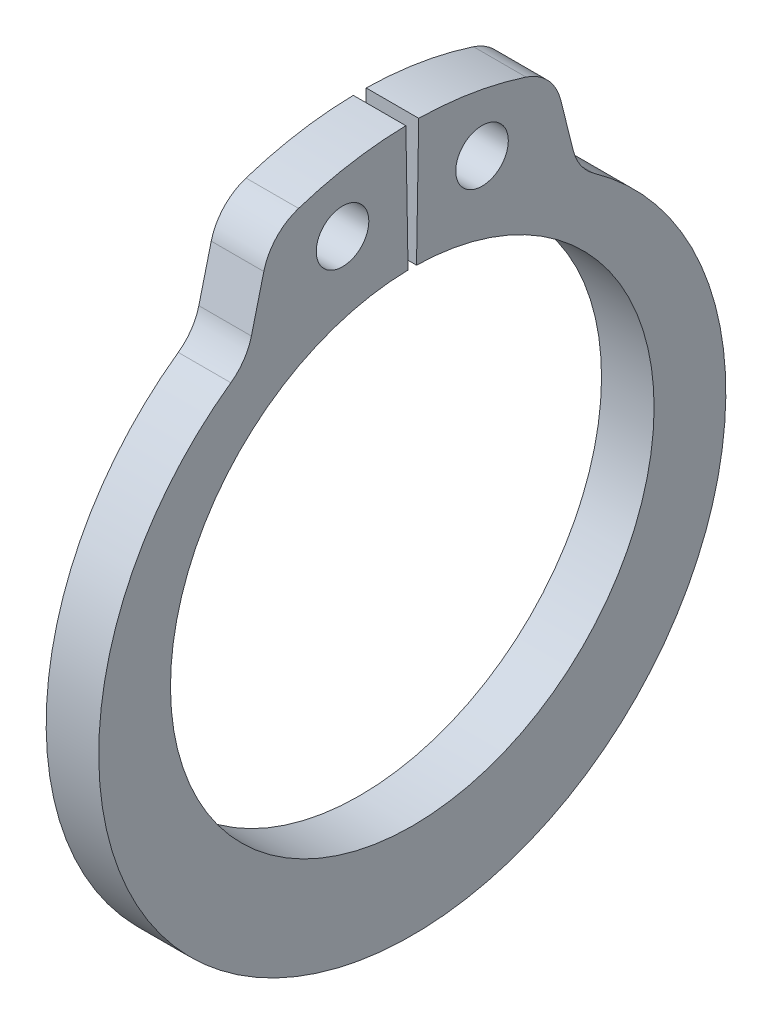
ISO-10303-21;
HEADER;
FILE_DESCRIPTION(('STEP AP214'),'2;1');
FILE_NAME('part.step','',(''),(''),'','','');
FILE_SCHEMA(('AUTOMOTIVE_DESIGN { 1 0 10303 214 1 1 1 1 }'));
ENDSEC;
DATA;
#1=APPLICATION_CONTEXT('core data for automotive mechanical design processes');
#2=APPLICATION_PROTOCOL_DEFINITION('international standard','automotive_design',2000,#1);
#3=PRODUCT_CONTEXT('',#1,'mechanical');
#4=PRODUCT('Part','Part','',(#3));
#5=PRODUCT_RELATED_PRODUCT_CATEGORY('part','',(#4));
#6=PRODUCT_DEFINITION_FORMATION('','',#4);
#7=PRODUCT_DEFINITION_CONTEXT('part definition',#1,'design');
#8=PRODUCT_DEFINITION('design','',#6,#7);
#9=PRODUCT_DEFINITION_SHAPE('','',#8);
#10=(LENGTH_UNIT() NAMED_UNIT(*) SI_UNIT(.MILLI.,.METRE.));
#11=(NAMED_UNIT(*) PLANE_ANGLE_UNIT() SI_UNIT($,.RADIAN.));
#12=(NAMED_UNIT(*) SI_UNIT($,.STERADIAN.) SOLID_ANGLE_UNIT());
#13=UNCERTAINTY_MEASURE_WITH_UNIT(LENGTH_MEASURE(1.E-05),#10,'distance_accuracy_value','');
#14=(GEOMETRIC_REPRESENTATION_CONTEXT(3) GLOBAL_UNCERTAINTY_ASSIGNED_CONTEXT((#13)) GLOBAL_UNIT_ASSIGNED_CONTEXT((#10,
#11,#12)) REPRESENTATION_CONTEXT('',''));
#15=CARTESIAN_POINT('',(0.,0.,0.));
#16=DIRECTION('',(0.,0.,1.));
#17=DIRECTION('',(1.,0.,0.));
#18=AXIS2_PLACEMENT_3D('',#15,#16,#17);
#19=CARTESIAN_POINT('',(0.634999999999997,0.,0.));
#20=DIRECTION('',(1.,0.,0.));
#21=DIRECTION('',(0.,0.,-1.));
#22=AXIS2_PLACEMENT_3D('',#19,#20,#21);
#23=PLANE('',#22);
#24=CARTESIAN_POINT('',(0.634999999999997,7.33771049478921,1.68498677622098));
#25=DIRECTION('',(1.,0.,0.));
#26=DIRECTION('',(0.,0.,-1.));
#27=AXIS2_PLACEMENT_3D('',#24,#25,#26);
#28=CIRCLE('',#27,0.635);
#29=CARTESIAN_POINT('',(0.634999999999997,7.33771049478921,1.04998677622097));
#30=VERTEX_POINT('',#29);
#31=EDGE_CURVE('E219',#30,#30,#28,.T.);
#32=ORIENTED_EDGE('',*,*,#31,.F.);
#33=EDGE_LOOP('',(#32));
#34=FACE_BOUND('',#33,.T.);
#35=CARTESIAN_POINT('',(0.634999999999997,0.,0.));
#36=DIRECTION('',(1.,0.,0.));
#37=DIRECTION('',(0.,0.,-1.));
#38=AXIS2_PLACEMENT_3D('',#35,#36,#37);
#39=CIRCLE('',#38,8.88999999999998);
#40=CARTESIAN_POINT('',(0.634999999999997,8.88864600994027,0.155151893227568));
#41=VERTEX_POINT('',#40);
#42=CARTESIAN_POINT('',(0.634999999999997,8.45481975457246,2.74738474147546));
#43=VERTEX_POINT('',#42);
#44=EDGE_CURVE('E136',#41,#43,#39,.T.);
#45=ORIENTED_EDGE('',*,*,#44,.T.);
#46=CARTESIAN_POINT('',(0.634999999999997,7.24698836106213,2.35490120697901));
#47=DIRECTION('',(1.,0.,0.));
#48=DIRECTION('',(0.,0.,-1.));
#49=AXIS2_PLACEMENT_3D('',#46,#47,#48);
#50=CIRCLE('',#49,1.27);
#51=CARTESIAN_POINT('',(0.634999999999997,7.5542291684737,3.58717677934939));
#52=VERTEX_POINT('',#51);
#53=EDGE_CURVE('E173',#43,#52,#50,.T.);
#54=ORIENTED_EDGE('',*,*,#53,.T.);
#55=DIRECTION('',(0.,-0.970295726276,0.24192189559966));
#56=VECTOR('',#55,1.);
#57=CARTESIAN_POINT('',(0.634999999999997,8.20363873719465,3.42526078855315));
#58=LINE('',#57,#56);
#59=CARTESIAN_POINT('',(0.634999999999997,6.35349195006737,3.88655419195427));
#60=VERTEX_POINT('',#59);
#61=EDGE_CURVE('E211',#52,#60,#58,.T.);
#62=ORIENTED_EDGE('',*,*,#61,.T.);
#63=CARTESIAN_POINT('',(0.634999999999997,6.66073275747919,5.11882976432476));
#64=DIRECTION('',(1.,0.,0.));
#65=DIRECTION('',(0.,0.,-1.));
#66=AXIS2_PLACEMENT_3D('',#63,#64,#65);
#67=CIRCLE('',#66,1.27);
#68=CARTESIAN_POINT('',(0.634999999999997,5.6250079501203,4.38386437505689));
#69=VERTEX_POINT('',#68);
#70=EDGE_CURVE('E184',#60,#69,#67,.F.);
#71=ORIENTED_EDGE('',*,*,#70,.T.);
#72=CARTESIAN_POINT('',(0.634999999999997,-0.552802803479135,2.22044604925031E-13));
#73=DIRECTION('',(1.,0.,0.));
#74=DIRECTION('',(0.,0.,-1.));
#75=AXIS2_PLACEMENT_3D('',#72,#73,#74);
#76=CIRCLE('',#75,7.57519719652095);
#77=CARTESIAN_POINT('',(0.634999999999997,5.62500795011989,-4.38386437505678));
#78=VERTEX_POINT('',#77);
#79=EDGE_CURVE('E206',#69,#78,#76,.T.);
#80=ORIENTED_EDGE('',*,*,#79,.T.);
#81=CARTESIAN_POINT('',(0.634999999999997,6.66073275747869,-5.11882976432459));
#82=DIRECTION('',(1.,0.,0.));
#83=DIRECTION('',(0.,0.,-1.));
#84=AXIS2_PLACEMENT_3D('',#81,#82,#83);
#85=CIRCLE('',#84,1.27);
#86=CARTESIAN_POINT('',(0.634999999999997,6.35349195006704,-3.88655419195427));
#87=VERTEX_POINT('',#86);
#88=EDGE_CURVE('E11',#78,#87,#85,.F.);
#89=ORIENTED_EDGE('',*,*,#88,.T.);
#90=DIRECTION('',(0.,0.970295726275969,0.241921895599793));
#91=VECTOR('',#90,1.);
#92=CARTESIAN_POINT('',(0.634999999999997,8.20363873719476,-3.42526078855288));
#93=LINE('',#92,#91);
#94=CARTESIAN_POINT('',(0.634999999999997,7.55422916847379,-3.58717677934917));
#95=VERTEX_POINT('',#94);
#96=EDGE_CURVE('E205',#87,#95,#93,.T.);
#97=ORIENTED_EDGE('',*,*,#96,.T.);
#98=CARTESIAN_POINT('',(0.634999999999997,7.24698836106205,-2.3549012069789));
#99=DIRECTION('',(1.,0.,0.));
#100=DIRECTION('',(0.,0.,-1.));
#101=AXIS2_PLACEMENT_3D('',#98,#99,#100);
#102=CIRCLE('',#101,1.27);
#103=CARTESIAN_POINT('',(0.634999999999997,8.45481975457224,-2.74738474147518));
#104=VERTEX_POINT('',#103);
#105=EDGE_CURVE('E51',#95,#104,#102,.T.);
#106=ORIENTED_EDGE('',*,*,#105,.T.);
#107=CARTESIAN_POINT('',(0.634999999999997,-5.32907051820075E-12,1.11022302462516E-12));
#108=DIRECTION('',(1.,0.,0.));
#109=DIRECTION('',(0.,0.,1.));
#110=AXIS2_PLACEMENT_3D('',#107,#108,#109);
#111=CIRCLE('',#110,8.89000000000527);
#112=CARTESIAN_POINT('',(0.634999999999997,8.88864600994022,-0.155151893227234));
#113=VERTEX_POINT('',#112);
#114=EDGE_CURVE('E208',#104,#113,#111,.T.);
#115=ORIENTED_EDGE('',*,*,#114,.T.);
#116=DIRECTION('',(0.,-0.999847695156393,0.0174524064372815));
#117=VECTOR('',#116,1.);
#118=CARTESIAN_POINT('',(0.634999999999997,8.88864600994022,-0.155151893227234));
#119=LINE('',#118,#117);
#120=CARTESIAN_POINT('',(0.634999999999997,5.84111023510367,-0.101956958406646));
#121=VERTEX_POINT('',#120);
#122=EDGE_CURVE('E142',#113,#121,#119,.T.);
#123=ORIENTED_EDGE('',*,*,#122,.T.);
#124=CARTESIAN_POINT('',(0.634999999999997,0.,0.));
#125=DIRECTION('',(-1.,0.,0.));
#126=DIRECTION('',(0.,0.,-1.));
#127=AXIS2_PLACEMENT_3D('',#124,#125,#126);
#128=CIRCLE('',#127,5.84199999999999);
#129=CARTESIAN_POINT('',(0.634999999999997,5.84111023510347,0.101956958406757));
#130=VERTEX_POINT('',#129);
#131=EDGE_CURVE('E137',#121,#130,#128,.T.);
#132=ORIENTED_EDGE('',*,*,#131,.T.);
#133=DIRECTION('',(0.,0.999847695156393,0.0174524064372863));
#134=VECTOR('',#133,1.);
#135=CARTESIAN_POINT('',(0.634999999999997,5.84111023510347,0.101956958406757));
#136=LINE('',#135,#134);
#137=EDGE_CURVE('E126',#130,#41,#136,.T.);
#138=ORIENTED_EDGE('',*,*,#137,.T.);
#139=EDGE_LOOP('',(#45,#54,#62,#71,#80,#89,#97,#106,#115,#123,#132,#138));
#140=FACE_BOUND('',#139,.T.);
#141=CARTESIAN_POINT('',(0.634999999999997,7.33771049478929,-1.68498677622086));
#142=DIRECTION('',(1.,0.,0.));
#143=DIRECTION('',(0.,0.,-1.));
#144=AXIS2_PLACEMENT_3D('',#141,#142,#143);
#145=CIRCLE('',#144,0.635);
#146=CARTESIAN_POINT('',(0.634999999999997,7.33771049478929,-2.31998677622087));
#147=VERTEX_POINT('',#146);
#148=EDGE_CURVE('E248',#147,#147,#145,.T.);
#149=ORIENTED_EDGE('',*,*,#148,.F.);
#150=EDGE_LOOP('',(#149));
#151=FACE_BOUND('',#150,.T.);
#152=ADVANCED_FACE('F36',(#34,#140,#151),#23,.T.);
#153=CARTESIAN_POINT('',(-0.634999999999997,0.,0.));
#154=DIRECTION('',(1.,0.,0.));
#155=DIRECTION('',(0.,0.,-1.));
#156=AXIS2_PLACEMENT_3D('',#153,#154,#155);
#157=PLANE('',#156);
#158=CARTESIAN_POINT('',(-0.634999999999997,7.33771049478921,1.68498677622098));
#159=DIRECTION('',(1.,0.,0.));
#160=DIRECTION('',(0.,0.,-1.));
#161=AXIS2_PLACEMENT_3D('',#158,#159,#160);
#162=CIRCLE('',#161,0.635);
#163=CARTESIAN_POINT('',(-0.634999999999997,7.33771049478921,1.04998677622097));
#164=VERTEX_POINT('',#163);
#165=EDGE_CURVE('E245',#164,#164,#162,.T.);
#166=ORIENTED_EDGE('',*,*,#165,.T.);
#167=EDGE_LOOP('',(#166));
#168=FACE_BOUND('',#167,.T.);
#169=DIRECTION('',(0.,-0.970295726276,0.24192189559966));
#170=VECTOR('',#169,1.);
#171=CARTESIAN_POINT('',(-0.634999999999997,8.20363873719465,3.42526078855315));
#172=LINE('',#171,#170);
#173=CARTESIAN_POINT('',(-0.634999999999997,7.5542291684737,3.58717677934939));
#174=VERTEX_POINT('',#173);
#175=CARTESIAN_POINT('',(-0.634999999999997,6.35349195006737,3.88655419195427));
#176=VERTEX_POINT('',#175);
#177=EDGE_CURVE('E202',#174,#176,#172,.T.);
#178=ORIENTED_EDGE('',*,*,#177,.F.);
#179=CARTESIAN_POINT('',(-0.634999999999997,7.24698836106213,2.35490120697901));
#180=DIRECTION('',(1.,0.,0.));
#181=DIRECTION('',(0.,0.,-1.));
#182=AXIS2_PLACEMENT_3D('',#179,#180,#181);
#183=CIRCLE('',#182,1.27);
#184=CARTESIAN_POINT('',(-0.634999999999997,8.45481975457246,2.74738474147546));
#185=VERTEX_POINT('',#184);
#186=EDGE_CURVE('E168',#174,#185,#183,.F.);
#187=ORIENTED_EDGE('',*,*,#186,.T.);
#188=CARTESIAN_POINT('',(-0.634999999999997,0.,0.));
#189=DIRECTION('',(1.,0.,0.));
#190=DIRECTION('',(0.,0.,-1.));
#191=AXIS2_PLACEMENT_3D('',#188,#189,#190);
#192=CIRCLE('',#191,8.88999999999998);
#193=CARTESIAN_POINT('',(-0.634999999999997,8.88864600994027,0.155151893227568));
#194=VERTEX_POINT('',#193);
#195=EDGE_CURVE('E221',#194,#185,#192,.T.);
#196=ORIENTED_EDGE('',*,*,#195,.F.);
#197=DIRECTION('',(0.,0.999847695156393,0.0174524064372863));
#198=VECTOR('',#197,1.);
#199=CARTESIAN_POINT('',(-0.634999999999997,5.84111023510347,0.101956958406757));
#200=LINE('',#199,#198);
#201=CARTESIAN_POINT('',(-0.634999999999997,5.84111023510347,0.101956958406757));
#202=VERTEX_POINT('',#201);
#203=EDGE_CURVE('E218',#202,#194,#200,.T.);
#204=ORIENTED_EDGE('',*,*,#203,.F.);
#205=CARTESIAN_POINT('',(-0.634999999999997,0.,0.));
#206=DIRECTION('',(-1.,0.,0.));
#207=DIRECTION('',(0.,0.,-1.));
#208=AXIS2_PLACEMENT_3D('',#205,#206,#207);
#209=CIRCLE('',#208,5.84199999999999);
#210=CARTESIAN_POINT('',(-0.634999999999997,5.84111023510367,-0.101956958406646));
#211=VERTEX_POINT('',#210);
#212=EDGE_CURVE('E150',#211,#202,#209,.T.);
#213=ORIENTED_EDGE('',*,*,#212,.F.);
#214=DIRECTION('',(0.,-0.999847695156393,0.0174524064372815));
#215=VECTOR('',#214,1.);
#216=CARTESIAN_POINT('',(-0.634999999999997,8.88864600994022,-0.155151893227234));
#217=LINE('',#216,#215);
#218=CARTESIAN_POINT('',(-0.634999999999997,8.88864600994022,-0.155151893227234));
#219=VERTEX_POINT('',#218);
#220=EDGE_CURVE('E146',#219,#211,#217,.T.);
#221=ORIENTED_EDGE('',*,*,#220,.F.);
#222=CARTESIAN_POINT('',(-0.634999999999997,-5.32907051820075E-12,1.11022302462516E-12));
#223=DIRECTION('',(1.,0.,0.));
#224=DIRECTION('',(0.,0.,1.));
#225=AXIS2_PLACEMENT_3D('',#222,#223,#224);
#226=CIRCLE('',#225,8.89000000000527);
#227=CARTESIAN_POINT('',(-0.634999999999997,8.45481975457224,-2.74738474147518));
#228=VERTEX_POINT('',#227);
#229=EDGE_CURVE('E227',#228,#219,#226,.T.);
#230=ORIENTED_EDGE('',*,*,#229,.F.);
#231=CARTESIAN_POINT('',(-0.634999999999997,7.24698836106205,-2.3549012069789));
#232=DIRECTION('',(1.,0.,0.));
#233=DIRECTION('',(0.,0.,-1.));
#234=AXIS2_PLACEMENT_3D('',#231,#232,#233);
#235=CIRCLE('',#234,1.27);
#236=CARTESIAN_POINT('',(-0.634999999999997,7.55422916847379,-3.58717677934917));
#237=VERTEX_POINT('',#236);
#238=EDGE_CURVE('E166',#228,#237,#235,.F.);
#239=ORIENTED_EDGE('',*,*,#238,.T.);
#240=DIRECTION('',(0.,0.970295726275969,0.241921895599793));
#241=VECTOR('',#240,1.);
#242=CARTESIAN_POINT('',(-0.634999999999997,8.20363873719476,-3.42526078855288));
#243=LINE('',#242,#241);
#244=CARTESIAN_POINT('',(-0.634999999999997,6.35349195006704,-3.88655419195427));
#245=VERTEX_POINT('',#244);
#246=EDGE_CURVE('E193',#245,#237,#243,.T.);
#247=ORIENTED_EDGE('',*,*,#246,.F.);
#248=CARTESIAN_POINT('',(-0.634999999999997,6.66073275747869,-5.11882976432459));
#249=DIRECTION('',(1.,0.,0.));
#250=DIRECTION('',(0.,0.,-1.));
#251=AXIS2_PLACEMENT_3D('',#248,#249,#250);
#252=CIRCLE('',#251,1.27);
#253=CARTESIAN_POINT('',(-0.634999999999997,5.62500795011989,-4.38386437505678));
#254=VERTEX_POINT('',#253);
#255=EDGE_CURVE('E44',#245,#254,#252,.T.);
#256=ORIENTED_EDGE('',*,*,#255,.T.);
#257=CARTESIAN_POINT('',(-0.634999999999997,-0.552802803479135,2.22044604925031E-13));
#258=DIRECTION('',(1.,0.,0.));
#259=DIRECTION('',(0.,0.,-1.));
#260=AXIS2_PLACEMENT_3D('',#257,#258,#259);
#261=CIRCLE('',#260,7.57519719652095);
#262=CARTESIAN_POINT('',(-0.634999999999997,5.6250079501203,4.38386437505689));
#263=VERTEX_POINT('',#262);
#264=EDGE_CURVE('E192',#263,#254,#261,.T.);
#265=ORIENTED_EDGE('',*,*,#264,.F.);
#266=CARTESIAN_POINT('',(-0.634999999999997,6.66073275747919,5.11882976432476));
#267=DIRECTION('',(1.,0.,0.));
#268=DIRECTION('',(0.,0.,-1.));
#269=AXIS2_PLACEMENT_3D('',#266,#267,#268);
#270=CIRCLE('',#269,1.27);
#271=EDGE_CURVE('E182',#263,#176,#270,.T.);
#272=ORIENTED_EDGE('',*,*,#271,.T.);
#273=EDGE_LOOP('',(#178,#187,#196,#204,#213,#221,#230,#239,#247,#256,#265,#272));
#274=FACE_BOUND('',#273,.T.);
#275=CARTESIAN_POINT('',(-0.634999999999997,7.33771049478929,-1.68498677622086));
#276=DIRECTION('',(1.,0.,0.));
#277=DIRECTION('',(0.,0.,-1.));
#278=AXIS2_PLACEMENT_3D('',#275,#276,#277);
#279=CIRCLE('',#278,0.635);
#280=CARTESIAN_POINT('',(-0.634999999999997,7.33771049478929,-2.31998677622087));
#281=VERTEX_POINT('',#280);
#282=EDGE_CURVE('E251',#281,#281,#279,.T.);
#283=ORIENTED_EDGE('',*,*,#282,.T.);
#284=EDGE_LOOP('',(#283));
#285=FACE_BOUND('',#284,.T.);
#286=ADVANCED_FACE('F190',(#168,#274,#285),#157,.F.);
#287=CARTESIAN_POINT('',(0.634999999999997,0.,0.));
#288=DIRECTION('',(-1.,0.,0.));
#289=DIRECTION('',(0.,0.,1.));
#290=AXIS2_PLACEMENT_3D('',#287,#288,#289);
#291=CYLINDRICAL_SURFACE('',#290,5.84199999999999);
#292=ORIENTED_EDGE('',*,*,#212,.T.);
#293=DIRECTION('',(-1.,0.,0.));
#294=VECTOR('',#293,1.);
#295=CARTESIAN_POINT('',(0.634999999999997,5.84111023510347,0.101956958406757));
#296=LINE('',#295,#294);
#297=EDGE_CURVE('E130',#130,#202,#296,.T.);
#298=ORIENTED_EDGE('',*,*,#297,.F.);
#299=ORIENTED_EDGE('',*,*,#131,.F.);
#300=DIRECTION('',(-1.,0.,0.));
#301=VECTOR('',#300,1.);
#302=CARTESIAN_POINT('',(0.634999999999997,5.84111023510367,-0.101956958406646));
#303=LINE('',#302,#301);
#304=EDGE_CURVE('E216',#121,#211,#303,.T.);
#305=ORIENTED_EDGE('',*,*,#304,.T.);
#306=EDGE_LOOP('',(#292,#298,#299,#305));
#307=FACE_BOUND('',#306,.T.);
#308=ADVANCED_FACE('F148',(#307),#291,.F.);
#309=CARTESIAN_POINT('',(0.634999999999997,5.84111023510347,0.101956958406757));
#310=DIRECTION('',(0.,-0.0174524064372814,0.999847695156395));
#311=DIRECTION('',(0.,-0.999847695156393,-0.0174524064372863));
#312=AXIS2_PLACEMENT_3D('',#309,#310,#311);
#313=PLANE('',#312);
#314=ORIENTED_EDGE('',*,*,#203,.T.);
#315=DIRECTION('',(-1.,0.,0.));
#316=VECTOR('',#315,1.);
#317=CARTESIAN_POINT('',(0.634999999999997,8.88864600994027,0.155151893227568));
#318=LINE('',#317,#316);
#319=EDGE_CURVE('E133',#41,#194,#318,.T.);
#320=ORIENTED_EDGE('',*,*,#319,.F.);
#321=ORIENTED_EDGE('',*,*,#137,.F.);
#322=ORIENTED_EDGE('',*,*,#297,.T.);
#323=EDGE_LOOP('',(#314,#320,#321,#322));
#324=FACE_BOUND('',#323,.T.);
#325=ADVANCED_FACE('F128',(#324),#313,.F.);
#326=CARTESIAN_POINT('',(0.634999999999997,0.,0.));
#327=DIRECTION('',(-1.,0.,0.));
#328=DIRECTION('',(0.,0.,1.));
#329=AXIS2_PLACEMENT_3D('',#326,#327,#328);
#330=CYLINDRICAL_SURFACE('',#329,8.88999999999998);
#331=ORIENTED_EDGE('',*,*,#195,.T.);
#332=DIRECTION('',(-1.,0.,0.));
#333=VECTOR('',#332,1.);
#334=CARTESIAN_POINT('',(0.634999999999997,8.45481975457246,2.74738474147546));
#335=LINE('',#334,#333);
#336=EDGE_CURVE('E170',#185,#43,#335,.F.);
#337=ORIENTED_EDGE('',*,*,#336,.T.);
#338=ORIENTED_EDGE('',*,*,#44,.F.);
#339=ORIENTED_EDGE('',*,*,#319,.T.);
#340=EDGE_LOOP('',(#331,#337,#338,#339));
#341=FACE_BOUND('',#340,.T.);
#342=ADVANCED_FACE('F239',(#341),#330,.T.);
#343=CARTESIAN_POINT('',(0.634999999999997,8.20363873719465,3.42526078855315));
#344=DIRECTION('',(0.,-0.241921895599664,-0.970295726276003));
#345=DIRECTION('',(0.,0.970295726276,-0.24192189559966));
#346=AXIS2_PLACEMENT_3D('',#343,#344,#345);
#347=PLANE('',#346);
#348=ORIENTED_EDGE('',*,*,#177,.T.);
#349=DIRECTION('',(1.,0.,0.));
#350=VECTOR('',#349,1.);
#351=CARTESIAN_POINT('',(0.634999999999997,6.35349195006737,3.88655419195427));
#352=LINE('',#351,#350);
#353=EDGE_CURVE('E164',#176,#60,#352,.T.);
#354=ORIENTED_EDGE('',*,*,#353,.T.);
#355=ORIENTED_EDGE('',*,*,#61,.F.);
#356=DIRECTION('',(-1.,0.,0.));
#357=VECTOR('',#356,1.);
#358=CARTESIAN_POINT('',(0.634999999999997,7.5542291684737,3.58717677934939));
#359=LINE('',#358,#357);
#360=EDGE_CURVE('E161',#52,#174,#359,.T.);
#361=ORIENTED_EDGE('',*,*,#360,.T.);
#362=EDGE_LOOP('',(#348,#354,#355,#361));
#363=FACE_BOUND('',#362,.T.);
#364=ADVANCED_FACE('F281',(#363),#347,.F.);
#365=CARTESIAN_POINT('',(0.634999999999997,-0.552802803479135,2.22044604925031E-13));
#366=DIRECTION('',(-1.,0.,0.));
#367=DIRECTION('',(0.,0.,1.));
#368=AXIS2_PLACEMENT_3D('',#365,#366,#367);
#369=CYLINDRICAL_SURFACE('',#368,7.57519719652095);
#370=ORIENTED_EDGE('',*,*,#79,.F.);
#371=DIRECTION('',(-1.,0.,0.));
#372=VECTOR('',#371,1.);
#373=CARTESIAN_POINT('',(0.634999999999997,5.6250079501203,4.38386437505689));
#374=LINE('',#373,#372);
#375=EDGE_CURVE('E153',#69,#263,#374,.T.);
#376=ORIENTED_EDGE('',*,*,#375,.T.);
#377=ORIENTED_EDGE('',*,*,#264,.T.);
#378=DIRECTION('',(-1.,0.,0.));
#379=VECTOR('',#378,1.);
#380=CARTESIAN_POINT('',(0.634999999999997,5.62500795011989,-4.38386437505678));
#381=LINE('',#380,#379);
#382=EDGE_CURVE('E151',#254,#78,#381,.F.);
#383=ORIENTED_EDGE('',*,*,#382,.T.);
#384=EDGE_LOOP('',(#370,#376,#377,#383));
#385=FACE_BOUND('',#384,.T.);
#386=ADVANCED_FACE('F199',(#385),#369,.T.);
#387=CARTESIAN_POINT('',(0.634999999999997,8.20363873719476,-3.42526078855288));
#388=DIRECTION('',(0.,-0.241921895599788,0.970295726275969));
#389=DIRECTION('',(0.,-0.970295726275969,-0.241921895599793));
#390=AXIS2_PLACEMENT_3D('',#387,#388,#389);
#391=PLANE('',#390);
#392=ORIENTED_EDGE('',*,*,#246,.T.);
#393=DIRECTION('',(-1.,0.,0.));
#394=VECTOR('',#393,1.);
#395=CARTESIAN_POINT('',(0.634999999999997,7.55422916847379,-3.58717677934917));
#396=LINE('',#395,#394);
#397=EDGE_CURVE('E59',#237,#95,#396,.F.);
#398=ORIENTED_EDGE('',*,*,#397,.T.);
#399=ORIENTED_EDGE('',*,*,#96,.F.);
#400=DIRECTION('',(1.,0.,0.));
#401=VECTOR('',#400,1.);
#402=CARTESIAN_POINT('',(-0.634999999999997,6.35349195006704,-3.88655419195427));
#403=LINE('',#402,#401);
#404=EDGE_CURVE('E178',#87,#245,#403,.F.);
#405=ORIENTED_EDGE('',*,*,#404,.T.);
#406=EDGE_LOOP('',(#392,#398,#399,#405));
#407=FACE_BOUND('',#406,.T.);
#408=ADVANCED_FACE('F207',(#407),#391,.F.);
#409=CARTESIAN_POINT('',(0.634999999999997,-5.32907051820075E-12,1.11022302462516E-12));
#410=DIRECTION('',(-1.,0.,0.));
#411=DIRECTION('',(0.,0.,1.));
#412=AXIS2_PLACEMENT_3D('',#409,#410,#411);
#413=CYLINDRICAL_SURFACE('',#412,8.89000000000527);
#414=ORIENTED_EDGE('',*,*,#114,.F.);
#415=DIRECTION('',(-1.,0.,0.));
#416=VECTOR('',#415,1.);
#417=CARTESIAN_POINT('',(0.634999999999997,8.45481975457224,-2.74738474147518));
#418=LINE('',#417,#416);
#419=EDGE_CURVE('E175',#104,#228,#418,.T.);
#420=ORIENTED_EDGE('',*,*,#419,.T.);
#421=ORIENTED_EDGE('',*,*,#229,.T.);
#422=DIRECTION('',(-1.,0.,0.));
#423=VECTOR('',#422,1.);
#424=CARTESIAN_POINT('',(0.634999999999997,8.88864600994022,-0.155151893227234));
#425=LINE('',#424,#423);
#426=EDGE_CURVE('E155',#113,#219,#425,.T.);
#427=ORIENTED_EDGE('',*,*,#426,.F.);
#428=EDGE_LOOP('',(#414,#420,#421,#427));
#429=FACE_BOUND('',#428,.T.);
#430=ADVANCED_FACE('F274',(#429),#413,.T.);
#431=CARTESIAN_POINT('',(0.634999999999997,8.88864600994022,-0.155151893227234));
#432=DIRECTION('',(0.,-0.0174524064372863,-0.999847695156395));
#433=DIRECTION('',(0.,0.999847695156393,-0.0174524064372815));
#434=AXIS2_PLACEMENT_3D('',#431,#432,#433);
#435=PLANE('',#434);
#436=ORIENTED_EDGE('',*,*,#220,.T.);
#437=ORIENTED_EDGE('',*,*,#304,.F.);
#438=ORIENTED_EDGE('',*,*,#122,.F.);
#439=ORIENTED_EDGE('',*,*,#426,.T.);
#440=EDGE_LOOP('',(#436,#437,#438,#439));
#441=FACE_BOUND('',#440,.T.);
#442=ADVANCED_FACE('F234',(#441),#435,.F.);
#443=CARTESIAN_POINT('',(0.634999999999997,7.33771049478921,1.68498677622098));
#444=DIRECTION('',(-1.,0.,0.));
#445=DIRECTION('',(0.,0.,1.));
#446=AXIS2_PLACEMENT_3D('',#443,#444,#445);
#447=CYLINDRICAL_SURFACE('',#446,0.635);
#448=ORIENTED_EDGE('',*,*,#31,.T.);
#449=EDGE_LOOP('',(#448));
#450=FACE_BOUND('',#449,.T.);
#451=ORIENTED_EDGE('',*,*,#165,.F.);
#452=EDGE_LOOP('',(#451));
#453=FACE_BOUND('',#452,.T.);
#454=ADVANCED_FACE('F269',(#450,#453),#447,.F.);
#455=CARTESIAN_POINT('',(0.634999999999997,7.33771049478929,-1.68498677622086));
#456=DIRECTION('',(-1.,0.,0.));
#457=DIRECTION('',(0.,0.,1.));
#458=AXIS2_PLACEMENT_3D('',#455,#456,#457);
#459=CYLINDRICAL_SURFACE('',#458,0.635);
#460=ORIENTED_EDGE('',*,*,#148,.T.);
#461=EDGE_LOOP('',(#460));
#462=FACE_BOUND('',#461,.T.);
#463=ORIENTED_EDGE('',*,*,#282,.F.);
#464=EDGE_LOOP('',(#463));
#465=FACE_BOUND('',#464,.T.);
#466=ADVANCED_FACE('F257',(#462,#465),#459,.F.);
#467=CARTESIAN_POINT('',(0.634999999999997,6.66073275747919,5.11882976432476));
#468=DIRECTION('',(-1.,0.,0.));
#469=DIRECTION('',(0.,0.,1.));
#470=AXIS2_PLACEMENT_3D('',#467,#468,#469);
#471=CYLINDRICAL_SURFACE('',#470,1.27);
#472=ORIENTED_EDGE('',*,*,#70,.F.);
#473=ORIENTED_EDGE('',*,*,#353,.F.);
#474=ORIENTED_EDGE('',*,*,#271,.F.);
#475=ORIENTED_EDGE('',*,*,#375,.F.);
#476=EDGE_LOOP('',(#472,#473,#474,#475));
#477=FACE_BOUND('',#476,.T.);
#478=ADVANCED_FACE('F291',(#477),#471,.F.);
#479=CARTESIAN_POINT('',(0.634999999999997,7.24698836106213,2.35490120697901));
#480=DIRECTION('',(-1.,0.,0.));
#481=DIRECTION('',(0.,0.,1.));
#482=AXIS2_PLACEMENT_3D('',#479,#480,#481);
#483=CYLINDRICAL_SURFACE('',#482,1.27);
#484=ORIENTED_EDGE('',*,*,#53,.F.);
#485=ORIENTED_EDGE('',*,*,#336,.F.);
#486=ORIENTED_EDGE('',*,*,#186,.F.);
#487=ORIENTED_EDGE('',*,*,#360,.F.);
#488=EDGE_LOOP('',(#484,#485,#486,#487));
#489=FACE_BOUND('',#488,.T.);
#490=ADVANCED_FACE('F294',(#489),#483,.T.);
#491=CARTESIAN_POINT('',(0.634999999999997,7.24698836106205,-2.3549012069789));
#492=DIRECTION('',(-1.,0.,0.));
#493=DIRECTION('',(0.,0.,1.));
#494=AXIS2_PLACEMENT_3D('',#491,#492,#493);
#495=CYLINDRICAL_SURFACE('',#494,1.27);
#496=ORIENTED_EDGE('',*,*,#105,.F.);
#497=ORIENTED_EDGE('',*,*,#397,.F.);
#498=ORIENTED_EDGE('',*,*,#238,.F.);
#499=ORIENTED_EDGE('',*,*,#419,.F.);
#500=EDGE_LOOP('',(#496,#497,#498,#499));
#501=FACE_BOUND('',#500,.T.);
#502=ADVANCED_FACE('F297',(#501),#495,.T.);
#503=CARTESIAN_POINT('',(0.634999999999997,6.66073275747869,-5.11882976432459));
#504=DIRECTION('',(-1.,0.,0.));
#505=DIRECTION('',(0.,0.,1.));
#506=AXIS2_PLACEMENT_3D('',#503,#504,#505);
#507=CYLINDRICAL_SURFACE('',#506,1.27);
#508=ORIENTED_EDGE('',*,*,#88,.F.);
#509=ORIENTED_EDGE('',*,*,#382,.F.);
#510=ORIENTED_EDGE('',*,*,#255,.F.);
#511=ORIENTED_EDGE('',*,*,#404,.F.);
#512=EDGE_LOOP('',(#508,#509,#510,#511));
#513=FACE_BOUND('',#512,.T.);
#514=ADVANCED_FACE('F38',(#513),#507,.F.);
#515=CLOSED_SHELL('',(#152,#286,#308,#325,#342,#364,#386,#408,#430,#442,#454,#466,#478,#490,
#502,#514));
#516=MANIFOLD_SOLID_BREP('B2',#515);
#517=ADVANCED_BREP_SHAPE_REPRESENTATION('',(#18,#516),#14);
#518=SHAPE_DEFINITION_REPRESENTATION(#9,#517);
ENDSEC;
END-ISO-10303-21;
